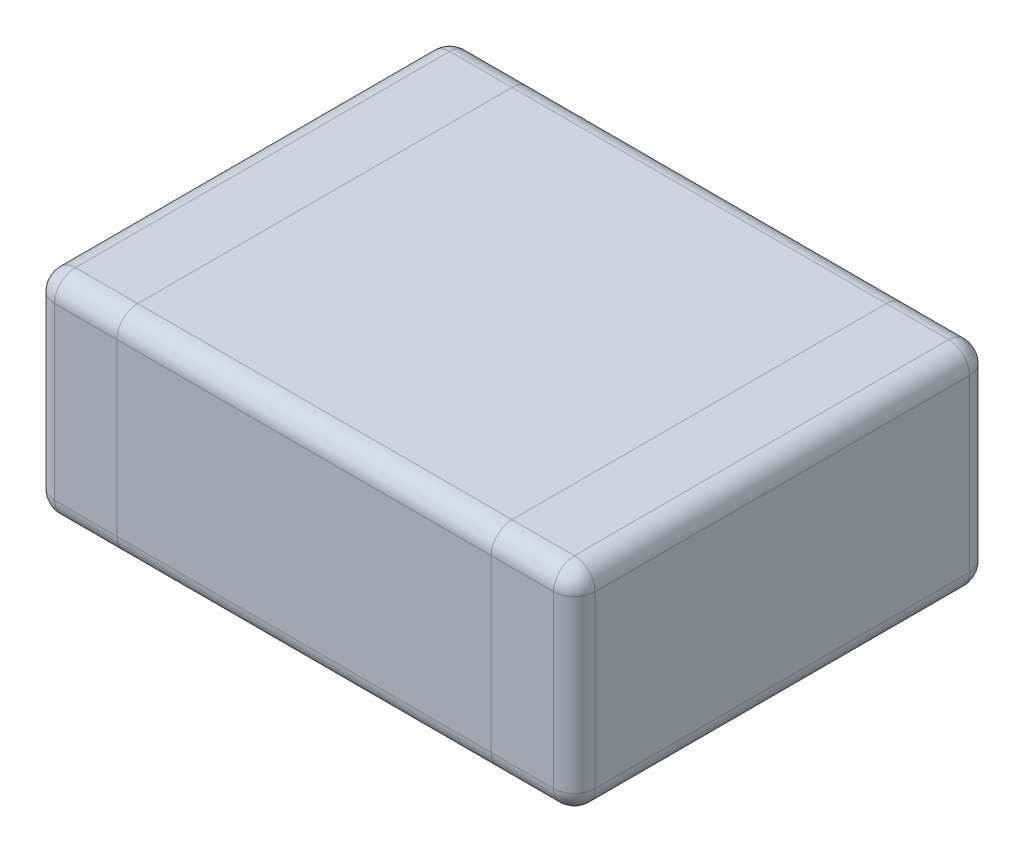
ISO-10303-21;
HEADER;
FILE_DESCRIPTION(('STEP AP214'),'2;1');
FILE_NAME('part.step','',(''),(''),'','','');
FILE_SCHEMA(('AUTOMOTIVE_DESIGN { 1 0 10303 214 1 1 1 1 }'));
ENDSEC;
DATA;
#1=APPLICATION_CONTEXT('core data for automotive mechanical design processes');
#2=APPLICATION_PROTOCOL_DEFINITION('international standard','automotive_design',2000,#1);
#3=PRODUCT_CONTEXT('',#1,'mechanical');
#4=PRODUCT('Part','Part','',(#3));
#5=PRODUCT_RELATED_PRODUCT_CATEGORY('part','',(#4));
#6=PRODUCT_DEFINITION_FORMATION('','',#4);
#7=PRODUCT_DEFINITION_CONTEXT('part definition',#1,'design');
#8=PRODUCT_DEFINITION('design','',#6,#7);
#9=PRODUCT_DEFINITION_SHAPE('','',#8);
#10=(LENGTH_UNIT() NAMED_UNIT(*) SI_UNIT(.MILLI.,.METRE.));
#11=(NAMED_UNIT(*) PLANE_ANGLE_UNIT() SI_UNIT($,.RADIAN.));
#12=(NAMED_UNIT(*) SI_UNIT($,.STERADIAN.) SOLID_ANGLE_UNIT());
#13=UNCERTAINTY_MEASURE_WITH_UNIT(LENGTH_MEASURE(1.E-05),#10,'distance_accuracy_value','');
#14=(GEOMETRIC_REPRESENTATION_CONTEXT(3) GLOBAL_UNCERTAINTY_ASSIGNED_CONTEXT((#13)) GLOBAL_UNIT_ASSIGNED_CONTEXT((#10,
#11,#12)) REPRESENTATION_CONTEXT('',''));
#15=CARTESIAN_POINT('',(0.,0.,0.));
#16=DIRECTION('',(0.,0.,1.));
#17=DIRECTION('',(1.,0.,0.));
#18=AXIS2_PLACEMENT_3D('',#15,#16,#17);
#19=CARTESIAN_POINT('',(0.65,0.51,-0.5));
#20=DIRECTION('',(0.,-1.,0.));
#21=DIRECTION('',(0.,0.,-1.));
#22=AXIS2_PLACEMENT_3D('',#19,#20,#21);
#23=PLANE('',#22);
#24=DIRECTION('',(0.,0.,1.));
#25=VECTOR('',#24,1.);
#26=CARTESIAN_POINT('',(-0.45,0.51,-0.5));
#27=LINE('',#26,#25);
#28=CARTESIAN_POINT('',(-0.45,0.51,-0.45));
#29=VERTEX_POINT('',#28);
#30=CARTESIAN_POINT('',(-0.45,0.51,0.45));
#31=VERTEX_POINT('',#30);
#32=EDGE_CURVE('E10',#29,#31,#27,.T.);
#33=ORIENTED_EDGE('',*,*,#32,.F.);
#34=DIRECTION('',(-1.,0.,0.));
#35=VECTOR('',#34,1.);
#36=CARTESIAN_POINT('',(0.65,0.51,-0.45));
#37=LINE('',#36,#35);
#38=CARTESIAN_POINT('',(-0.6,0.51,-0.45));
#39=VERTEX_POINT('',#38);
#40=EDGE_CURVE('E230',#29,#39,#37,.T.);
#41=ORIENTED_EDGE('',*,*,#40,.T.);
#42=DIRECTION('',(0.,0.,1.));
#43=VECTOR('',#42,1.);
#44=CARTESIAN_POINT('',(-0.6,0.51,-0.5));
#45=LINE('',#44,#43);
#46=CARTESIAN_POINT('',(-0.6,0.51,0.45));
#47=VERTEX_POINT('',#46);
#48=EDGE_CURVE('E233',#39,#47,#45,.T.);
#49=ORIENTED_EDGE('',*,*,#48,.T.);
#50=DIRECTION('',(1.,0.,0.));
#51=VECTOR('',#50,1.);
#52=CARTESIAN_POINT('',(0.65,0.51,0.45));
#53=LINE('',#52,#51);
#54=EDGE_CURVE('E237',#47,#31,#53,.T.);
#55=ORIENTED_EDGE('',*,*,#54,.T.);
#56=EDGE_LOOP('',(#33,#41,#49,#55));
#57=FACE_BOUND('',#56,.T.);
#58=ADVANCED_FACE('F15',(#57),#23,.F.);
#59=DIRECTION('',(0.,0.,-1.));
#60=VECTOR('',#59,1.);
#61=CARTESIAN_POINT('',(0.45,0.51,-0.5));
#62=LINE('',#61,#60);
#63=CARTESIAN_POINT('',(0.45,0.51,0.45));
#64=VERTEX_POINT('',#63);
#65=CARTESIAN_POINT('',(0.45,0.51,-0.45));
#66=VERTEX_POINT('',#65);
#67=EDGE_CURVE('E24',#64,#66,#62,.T.);
#68=ORIENTED_EDGE('',*,*,#67,.F.);
#69=CARTESIAN_POINT('',(0.6,0.51,0.45));
#70=VERTEX_POINT('',#69);
#71=EDGE_CURVE('E236',#64,#70,#53,.T.);
#72=ORIENTED_EDGE('',*,*,#71,.T.);
#73=DIRECTION('',(0.,0.,-1.));
#74=VECTOR('',#73,1.);
#75=CARTESIAN_POINT('',(0.6,0.51,-0.5));
#76=LINE('',#75,#74);
#77=CARTESIAN_POINT('',(0.6,0.51,-0.45));
#78=VERTEX_POINT('',#77);
#79=EDGE_CURVE('E227',#70,#78,#76,.T.);
#80=ORIENTED_EDGE('',*,*,#79,.T.);
#81=EDGE_CURVE('E231',#78,#66,#37,.T.);
#82=ORIENTED_EDGE('',*,*,#81,.T.);
#83=EDGE_LOOP('',(#68,#72,#80,#82));
#84=FACE_BOUND('',#83,.T.);
#85=ADVANCED_FACE('F488',(#84),#23,.F.);
#86=CARTESIAN_POINT('',(0.65,0.46,0.45));
#87=DIRECTION('',(1.,0.,0.));
#88=DIRECTION('',(0.,0.,-1.));
#89=AXIS2_PLACEMENT_3D('',#86,#87,#88);
#90=CYLINDRICAL_SURFACE('',#89,0.05);
#91=DIRECTION('',(1.,0.,0.));
#92=VECTOR('',#91,1.);
#93=CARTESIAN_POINT('',(-0.65,0.46,0.5));
#94=LINE('',#93,#92);
#95=CARTESIAN_POINT('',(-0.45,0.46,0.5));
#96=VERTEX_POINT('',#95);
#97=CARTESIAN_POINT('',(-0.6,0.46,0.5));
#98=VERTEX_POINT('',#97);
#99=EDGE_CURVE('E223',#96,#98,#94,.F.);
#100=ORIENTED_EDGE('',*,*,#99,.F.);
#101=CARTESIAN_POINT('',(-0.45,0.46,0.45));
#102=DIRECTION('',(1.,0.,0.));
#103=DIRECTION('',(0.,0.,-1.));
#104=AXIS2_PLACEMENT_3D('',#101,#102,#103);
#105=CIRCLE('',#104,0.05);
#106=EDGE_CURVE('E327',#96,#31,#105,.F.);
#107=ORIENTED_EDGE('',*,*,#106,.T.);
#108=ORIENTED_EDGE('',*,*,#54,.F.);
#109=CARTESIAN_POINT('',(-0.6,0.46,0.45));
#110=DIRECTION('',(-1.,0.,0.));
#111=DIRECTION('',(0.,-1.,0.));
#112=AXIS2_PLACEMENT_3D('',#109,#110,#111);
#113=CIRCLE('',#112,0.05);
#114=EDGE_CURVE('E307',#47,#98,#113,.F.);
#115=ORIENTED_EDGE('',*,*,#114,.T.);
#116=EDGE_LOOP('',(#100,#107,#108,#115));
#117=FACE_BOUND('',#116,.T.);
#118=ADVANCED_FACE('F443',(#117),#90,.T.);
#119=ORIENTED_EDGE('',*,*,#71,.F.);
#120=CARTESIAN_POINT('',(0.45,0.46,0.45));
#121=DIRECTION('',(-1.,0.,0.));
#122=DIRECTION('',(0.,0.,1.));
#123=AXIS2_PLACEMENT_3D('',#120,#121,#122);
#124=CIRCLE('',#123,0.05);
#125=CARTESIAN_POINT('',(0.45,0.46,0.5));
#126=VERTEX_POINT('',#125);
#127=EDGE_CURVE('E326',#64,#126,#124,.F.);
#128=ORIENTED_EDGE('',*,*,#127,.T.);
#129=CARTESIAN_POINT('',(0.6,0.46,0.5));
#130=VERTEX_POINT('',#129);
#131=EDGE_CURVE('E224',#130,#126,#94,.F.);
#132=ORIENTED_EDGE('',*,*,#131,.F.);
#133=CARTESIAN_POINT('',(0.6,0.46,0.45));
#134=DIRECTION('',(1.,0.,0.));
#135=DIRECTION('',(0.,0.,-1.));
#136=AXIS2_PLACEMENT_3D('',#133,#134,#135);
#137=CIRCLE('',#136,0.05);
#138=EDGE_CURVE('E292',#70,#130,#137,.T.);
#139=ORIENTED_EDGE('',*,*,#138,.F.);
#140=EDGE_LOOP('',(#119,#128,#132,#139));
#141=FACE_BOUND('',#140,.T.);
#142=ADVANCED_FACE('F417',(#141),#90,.T.);
#143=CARTESIAN_POINT('',(-0.65,0.51,0.5));
#144=DIRECTION('',(0.,0.,-1.));
#145=DIRECTION('',(-1.,0.,0.));
#146=AXIS2_PLACEMENT_3D('',#143,#144,#145);
#147=PLANE('',#146);
#148=DIRECTION('',(0.,-1.,0.));
#149=VECTOR('',#148,1.);
#150=CARTESIAN_POINT('',(-0.45,0.51,0.5));
#151=LINE('',#150,#149);
#152=CARTESIAN_POINT('',(-0.45,0.05,0.5));
#153=VERTEX_POINT('',#152);
#154=EDGE_CURVE('E323',#96,#153,#151,.T.);
#155=ORIENTED_EDGE('',*,*,#154,.F.);
#156=ORIENTED_EDGE('',*,*,#99,.T.);
#157=DIRECTION('',(0.,-1.,0.));
#158=VECTOR('',#157,1.);
#159=CARTESIAN_POINT('',(-0.6,0.51,0.5));
#160=LINE('',#159,#158);
#161=CARTESIAN_POINT('',(-0.6,0.05,0.5));
#162=VERTEX_POINT('',#161);
#163=EDGE_CURVE('E220',#98,#162,#160,.T.);
#164=ORIENTED_EDGE('',*,*,#163,.T.);
#165=DIRECTION('',(1.,0.,0.));
#166=VECTOR('',#165,1.);
#167=CARTESIAN_POINT('',(0.65,0.05,0.5));
#168=LINE('',#167,#166);
#169=EDGE_CURVE('E214',#162,#153,#168,.T.);
#170=ORIENTED_EDGE('',*,*,#169,.T.);
#171=EDGE_LOOP('',(#155,#156,#164,#170));
#172=FACE_BOUND('',#171,.T.);
#173=ADVANCED_FACE('F431',(#172),#147,.F.);
#174=DIRECTION('',(0.,1.,0.));
#175=VECTOR('',#174,1.);
#176=CARTESIAN_POINT('',(0.45,0.51,0.5));
#177=LINE('',#176,#175);
#178=CARTESIAN_POINT('',(0.45,0.05,0.5));
#179=VERTEX_POINT('',#178);
#180=EDGE_CURVE('E320',#179,#126,#177,.T.);
#181=ORIENTED_EDGE('',*,*,#180,.F.);
#182=CARTESIAN_POINT('',(0.6,0.05,0.5));
#183=VERTEX_POINT('',#182);
#184=EDGE_CURVE('E213',#179,#183,#168,.T.);
#185=ORIENTED_EDGE('',*,*,#184,.T.);
#186=DIRECTION('',(0.,-1.,0.));
#187=VECTOR('',#186,1.);
#188=CARTESIAN_POINT('',(0.6,0.51,0.5));
#189=LINE('',#188,#187);
#190=EDGE_CURVE('E217',#183,#130,#189,.F.);
#191=ORIENTED_EDGE('',*,*,#190,.T.);
#192=ORIENTED_EDGE('',*,*,#131,.T.);
#193=EDGE_LOOP('',(#181,#185,#191,#192));
#194=FACE_BOUND('',#193,.T.);
#195=ADVANCED_FACE('F413',(#194),#147,.F.);
#196=CARTESIAN_POINT('',(-0.65,0.05,0.45));
#197=DIRECTION('',(-1.,0.,0.));
#198=DIRECTION('',(0.,0.,1.));
#199=AXIS2_PLACEMENT_3D('',#196,#197,#198);
#200=CYLINDRICAL_SURFACE('',#199,0.05);
#201=DIRECTION('',(1.,0.,0.));
#202=VECTOR('',#201,1.);
#203=CARTESIAN_POINT('',(-0.65,0.,0.45));
#204=LINE('',#203,#202);
#205=CARTESIAN_POINT('',(-0.45,0.,0.45));
#206=VERTEX_POINT('',#205);
#207=CARTESIAN_POINT('',(-0.6,0.,0.45));
#208=VERTEX_POINT('',#207);
#209=EDGE_CURVE('E243',#206,#208,#204,.F.);
#210=ORIENTED_EDGE('',*,*,#209,.F.);
#211=CARTESIAN_POINT('',(-0.45,0.05,0.45));
#212=DIRECTION('',(1.,0.,0.));
#213=DIRECTION('',(0.,0.,-1.));
#214=AXIS2_PLACEMENT_3D('',#211,#212,#213);
#215=CIRCLE('',#214,0.05);
#216=EDGE_CURVE('E324',#206,#153,#215,.F.);
#217=ORIENTED_EDGE('',*,*,#216,.T.);
#218=ORIENTED_EDGE('',*,*,#169,.F.);
#219=CARTESIAN_POINT('',(-0.6,0.05,0.45));
#220=DIRECTION('',(-1.,0.,0.));
#221=DIRECTION('',(0.,0.,1.));
#222=AXIS2_PLACEMENT_3D('',#219,#220,#221);
#223=CIRCLE('',#222,0.05);
#224=EDGE_CURVE('E298',#162,#208,#223,.F.);
#225=ORIENTED_EDGE('',*,*,#224,.T.);
#226=EDGE_LOOP('',(#210,#217,#218,#225));
#227=FACE_BOUND('',#226,.T.);
#228=ADVANCED_FACE('F469',(#227),#200,.T.);
#229=ORIENTED_EDGE('',*,*,#184,.F.);
#230=CARTESIAN_POINT('',(0.45,0.05,0.45));
#231=DIRECTION('',(-1.,0.,0.));
#232=DIRECTION('',(0.,0.,1.));
#233=AXIS2_PLACEMENT_3D('',#230,#231,#232);
#234=CIRCLE('',#233,0.05);
#235=CARTESIAN_POINT('',(0.45,0.,0.45));
#236=VERTEX_POINT('',#235);
#237=EDGE_CURVE('E335',#179,#236,#234,.F.);
#238=ORIENTED_EDGE('',*,*,#237,.T.);
#239=CARTESIAN_POINT('',(0.6,0.,0.45));
#240=VERTEX_POINT('',#239);
#241=EDGE_CURVE('E244',#240,#236,#204,.F.);
#242=ORIENTED_EDGE('',*,*,#241,.F.);
#243=CARTESIAN_POINT('',(0.6,0.05,0.45));
#244=DIRECTION('',(1.,0.,0.));
#245=DIRECTION('',(0.,0.,-1.));
#246=AXIS2_PLACEMENT_3D('',#243,#244,#245);
#247=CIRCLE('',#246,0.05);
#248=EDGE_CURVE('E278',#183,#240,#247,.T.);
#249=ORIENTED_EDGE('',*,*,#248,.F.);
#250=EDGE_LOOP('',(#229,#238,#242,#249));
#251=FACE_BOUND('',#250,.T.);
#252=ADVANCED_FACE('F403',(#251),#200,.T.);
#253=CARTESIAN_POINT('',(0.65,0.,-0.5));
#254=DIRECTION('',(0.,-1.,0.));
#255=DIRECTION('',(0.,0.,-1.));
#256=AXIS2_PLACEMENT_3D('',#253,#254,#255);
#257=PLANE('',#256);
#258=DIRECTION('',(-1.,0.,0.));
#259=VECTOR('',#258,1.);
#260=CARTESIAN_POINT('',(0.65,0.,-0.45));
#261=LINE('',#260,#259);
#262=CARTESIAN_POINT('',(-0.6,0.,-0.45));
#263=VERTEX_POINT('',#262);
#264=CARTESIAN_POINT('',(-0.45,0.,-0.45));
#265=VERTEX_POINT('',#264);
#266=EDGE_CURVE('E251',#263,#265,#261,.F.);
#267=ORIENTED_EDGE('',*,*,#266,.T.);
#268=DIRECTION('',(0.,0.,1.));
#269=VECTOR('',#268,1.);
#270=CARTESIAN_POINT('',(-0.45,0.,-0.5));
#271=LINE('',#270,#269);
#272=EDGE_CURVE('E336',#265,#206,#271,.T.);
#273=ORIENTED_EDGE('',*,*,#272,.T.);
#274=ORIENTED_EDGE('',*,*,#209,.T.);
#275=DIRECTION('',(0.,0.,1.));
#276=VECTOR('',#275,1.);
#277=CARTESIAN_POINT('',(-0.6,0.,-0.5));
#278=LINE('',#277,#276);
#279=EDGE_CURVE('E247',#208,#263,#278,.F.);
#280=ORIENTED_EDGE('',*,*,#279,.T.);
#281=EDGE_LOOP('',(#267,#273,#274,#280));
#282=FACE_BOUND('',#281,.T.);
#283=ADVANCED_FACE('F472',(#282),#257,.T.);
#284=ORIENTED_EDGE('',*,*,#241,.T.);
#285=DIRECTION('',(0.,0.,-1.));
#286=VECTOR('',#285,1.);
#287=CARTESIAN_POINT('',(0.45,0.,-0.5));
#288=LINE('',#287,#286);
#289=CARTESIAN_POINT('',(0.45,0.,-0.45));
#290=VERTEX_POINT('',#289);
#291=EDGE_CURVE('E331',#236,#290,#288,.T.);
#292=ORIENTED_EDGE('',*,*,#291,.T.);
#293=CARTESIAN_POINT('',(0.6,0.,-0.45));
#294=VERTEX_POINT('',#293);
#295=EDGE_CURVE('E250',#290,#294,#261,.F.);
#296=ORIENTED_EDGE('',*,*,#295,.T.);
#297=DIRECTION('',(0.,0.,-1.));
#298=VECTOR('',#297,1.);
#299=CARTESIAN_POINT('',(0.6,0.,0.5));
#300=LINE('',#299,#298);
#301=EDGE_CURVE('E240',#294,#240,#300,.F.);
#302=ORIENTED_EDGE('',*,*,#301,.T.);
#303=EDGE_LOOP('',(#284,#292,#296,#302));
#304=FACE_BOUND('',#303,.T.);
#305=ADVANCED_FACE('F348',(#304),#257,.T.);
#306=CARTESIAN_POINT('',(0.65,0.46,-0.45));
#307=DIRECTION('',(-1.,0.,0.));
#308=DIRECTION('',(0.,0.,1.));
#309=AXIS2_PLACEMENT_3D('',#306,#307,#308);
#310=CYLINDRICAL_SURFACE('',#309,0.05);
#311=ORIENTED_EDGE('',*,*,#40,.F.);
#312=CARTESIAN_POINT('',(-0.45,0.46,-0.45));
#313=DIRECTION('',(1.,0.,0.));
#314=DIRECTION('',(0.,0.,-1.));
#315=AXIS2_PLACEMENT_3D('',#312,#313,#314);
#316=CIRCLE('',#315,0.05);
#317=CARTESIAN_POINT('',(-0.45,0.46,-0.5));
#318=VERTEX_POINT('',#317);
#319=EDGE_CURVE('E329',#29,#318,#316,.F.);
#320=ORIENTED_EDGE('',*,*,#319,.T.);
#321=DIRECTION('',(-1.,0.,0.));
#322=VECTOR('',#321,1.);
#323=CARTESIAN_POINT('',(-0.65,0.46,-0.5));
#324=LINE('',#323,#322);
#325=CARTESIAN_POINT('',(-0.6,0.46,-0.5));
#326=VERTEX_POINT('',#325);
#327=EDGE_CURVE('E193',#326,#318,#324,.F.);
#328=ORIENTED_EDGE('',*,*,#327,.F.);
#329=CARTESIAN_POINT('',(-0.6,0.46,-0.45));
#330=DIRECTION('',(-1.,0.,0.));
#331=DIRECTION('',(0.,0.,1.));
#332=AXIS2_PLACEMENT_3D('',#329,#330,#331);
#333=CIRCLE('',#332,0.05);
#334=EDGE_CURVE('E269',#326,#39,#333,.F.);
#335=ORIENTED_EDGE('',*,*,#334,.T.);
#336=EDGE_LOOP('',(#311,#320,#328,#335));
#337=FACE_BOUND('',#336,.T.);
#338=ADVANCED_FACE('F481',(#337),#310,.T.);
#339=CARTESIAN_POINT('',(0.45,0.46,-0.5));
#340=VERTEX_POINT('',#339);
#341=CARTESIAN_POINT('',(0.6,0.46,-0.5));
#342=VERTEX_POINT('',#341);
#343=EDGE_CURVE('E188',#340,#342,#324,.F.);
#344=ORIENTED_EDGE('',*,*,#343,.F.);
#345=CARTESIAN_POINT('',(0.45,0.46,-0.45));
#346=DIRECTION('',(-1.,0.,0.));
#347=DIRECTION('',(0.,0.,1.));
#348=AXIS2_PLACEMENT_3D('',#345,#346,#347);
#349=CIRCLE('',#348,0.05);
#350=EDGE_CURVE('E332',#340,#66,#349,.F.);
#351=ORIENTED_EDGE('',*,*,#350,.T.);
#352=ORIENTED_EDGE('',*,*,#81,.F.);
#353=CARTESIAN_POINT('',(0.6,0.46,-0.45));
#354=DIRECTION('',(1.,0.,0.));
#355=DIRECTION('',(0.,1.,0.));
#356=AXIS2_PLACEMENT_3D('',#353,#354,#355);
#357=CIRCLE('',#356,0.05);
#358=EDGE_CURVE('E173',#342,#78,#357,.T.);
#359=ORIENTED_EDGE('',*,*,#358,.F.);
#360=EDGE_LOOP('',(#344,#351,#352,#359));
#361=FACE_BOUND('',#360,.T.);
#362=ADVANCED_FACE('F382',(#361),#310,.T.);
#363=CARTESIAN_POINT('',(-0.65,0.05,-0.45));
#364=DIRECTION('',(1.,0.,0.));
#365=DIRECTION('',(0.,0.,-1.));
#366=AXIS2_PLACEMENT_3D('',#363,#364,#365);
#367=CYLINDRICAL_SURFACE('',#366,0.05);
#368=DIRECTION('',(-1.,0.,0.));
#369=VECTOR('',#368,1.);
#370=CARTESIAN_POINT('',(-0.65,0.05,-0.5));
#371=LINE('',#370,#369);
#372=CARTESIAN_POINT('',(-0.45,0.05,-0.5));
#373=VERTEX_POINT('',#372);
#374=CARTESIAN_POINT('',(-0.6,0.05,-0.5));
#375=VERTEX_POINT('',#374);
#376=EDGE_CURVE('E185',#373,#375,#371,.T.);
#377=ORIENTED_EDGE('',*,*,#376,.F.);
#378=CARTESIAN_POINT('',(-0.45,0.05,-0.45));
#379=DIRECTION('',(1.,0.,0.));
#380=DIRECTION('',(0.,0.,-1.));
#381=AXIS2_PLACEMENT_3D('',#378,#379,#380);
#382=CIRCLE('',#381,0.05);
#383=EDGE_CURVE('E339',#373,#265,#382,.F.);
#384=ORIENTED_EDGE('',*,*,#383,.T.);
#385=ORIENTED_EDGE('',*,*,#266,.F.);
#386=CARTESIAN_POINT('',(-0.6,0.05,-0.45));
#387=DIRECTION('',(-1.,0.,0.));
#388=DIRECTION('',(0.,0.,1.));
#389=AXIS2_PLACEMENT_3D('',#386,#387,#388);
#390=CIRCLE('',#389,0.05);
#391=EDGE_CURVE('E266',#263,#375,#390,.F.);
#392=ORIENTED_EDGE('',*,*,#391,.T.);
#393=EDGE_LOOP('',(#377,#384,#385,#392));
#394=FACE_BOUND('',#393,.T.);
#395=ADVANCED_FACE('F365',(#394),#367,.T.);
#396=ORIENTED_EDGE('',*,*,#295,.F.);
#397=CARTESIAN_POINT('',(0.45,0.05,-0.45));
#398=DIRECTION('',(-1.,0.,0.));
#399=DIRECTION('',(0.,0.,1.));
#400=AXIS2_PLACEMENT_3D('',#397,#398,#399);
#401=CIRCLE('',#400,0.05);
#402=CARTESIAN_POINT('',(0.45,0.05,-0.5));
#403=VERTEX_POINT('',#402);
#404=EDGE_CURVE('E19',#290,#403,#401,.F.);
#405=ORIENTED_EDGE('',*,*,#404,.T.);
#406=CARTESIAN_POINT('',(0.6,0.05,-0.5));
#407=VERTEX_POINT('',#406);
#408=EDGE_CURVE('E176',#407,#403,#371,.T.);
#409=ORIENTED_EDGE('',*,*,#408,.F.);
#410=CARTESIAN_POINT('',(0.6,0.05,-0.45));
#411=DIRECTION('',(1.,0.,0.));
#412=DIRECTION('',(0.,0.,-1.));
#413=AXIS2_PLACEMENT_3D('',#410,#411,#412);
#414=CIRCLE('',#413,0.05);
#415=EDGE_CURVE('E165',#294,#407,#414,.T.);
#416=ORIENTED_EDGE('',*,*,#415,.F.);
#417=EDGE_LOOP('',(#396,#405,#409,#416));
#418=FACE_BOUND('',#417,.T.);
#419=ADVANCED_FACE('F177',(#418),#367,.T.);
#420=CARTESIAN_POINT('',(-0.65,0.51,-0.5));
#421=DIRECTION('',(0.,0.,1.));
#422=DIRECTION('',(1.,0.,0.));
#423=AXIS2_PLACEMENT_3D('',#420,#421,#422);
#424=PLANE('',#423);
#425=DIRECTION('',(0.,1.,0.));
#426=VECTOR('',#425,1.);
#427=CARTESIAN_POINT('',(-0.45,0.51,-0.5));
#428=LINE('',#427,#426);
#429=EDGE_CURVE('E317',#373,#318,#428,.T.);
#430=ORIENTED_EDGE('',*,*,#429,.F.);
#431=ORIENTED_EDGE('',*,*,#376,.T.);
#432=DIRECTION('',(0.,-1.,0.));
#433=VECTOR('',#432,1.);
#434=CARTESIAN_POINT('',(-0.6,0.51,-0.5));
#435=LINE('',#434,#433);
#436=EDGE_CURVE('E182',#375,#326,#435,.F.);
#437=ORIENTED_EDGE('',*,*,#436,.T.);
#438=ORIENTED_EDGE('',*,*,#327,.T.);
#439=EDGE_LOOP('',(#430,#431,#437,#438));
#440=FACE_BOUND('',#439,.T.);
#441=ADVANCED_FACE('F368',(#440),#424,.F.);
#442=DIRECTION('',(0.,-1.,0.));
#443=VECTOR('',#442,1.);
#444=CARTESIAN_POINT('',(0.45,0.51,-0.5));
#445=LINE('',#444,#443);
#446=EDGE_CURVE('E253',#340,#403,#445,.T.);
#447=ORIENTED_EDGE('',*,*,#446,.F.);
#448=ORIENTED_EDGE('',*,*,#343,.T.);
#449=DIRECTION('',(0.,-1.,0.));
#450=VECTOR('',#449,1.);
#451=CARTESIAN_POINT('',(0.6,0.51,-0.5));
#452=LINE('',#451,#450);
#453=EDGE_CURVE('E157',#342,#407,#452,.T.);
#454=ORIENTED_EDGE('',*,*,#453,.T.);
#455=ORIENTED_EDGE('',*,*,#408,.T.);
#456=EDGE_LOOP('',(#447,#448,#454,#455));
#457=FACE_BOUND('',#456,.T.);
#458=ADVANCED_FACE('F186',(#457),#424,.F.);
#459=CARTESIAN_POINT('',(0.65,0.51,0.5));
#460=DIRECTION('',(-1.,0.,0.));
#461=DIRECTION('',(0.,0.,1.));
#462=AXIS2_PLACEMENT_3D('',#459,#460,#461);
#463=PLANE('',#462);
#464=DIRECTION('',(0.,-1.,0.));
#465=VECTOR('',#464,1.);
#466=CARTESIAN_POINT('',(0.65,0.51,-0.45));
#467=LINE('',#466,#465);
#468=CARTESIAN_POINT('',(0.65,0.05,-0.45));
#469=VERTEX_POINT('',#468);
#470=CARTESIAN_POINT('',(0.65,0.46,-0.45));
#471=VERTEX_POINT('',#470);
#472=EDGE_CURVE('E159',#469,#471,#467,.F.);
#473=ORIENTED_EDGE('',*,*,#472,.T.);
#474=DIRECTION('',(0.,0.,-1.));
#475=VECTOR('',#474,1.);
#476=CARTESIAN_POINT('',(0.65,0.46,0.5));
#477=LINE('',#476,#475);
#478=CARTESIAN_POINT('',(0.65,0.46,0.45));
#479=VERTEX_POINT('',#478);
#480=EDGE_CURVE('E202',#471,#479,#477,.F.);
#481=ORIENTED_EDGE('',*,*,#480,.T.);
#482=DIRECTION('',(0.,-1.,0.));
#483=VECTOR('',#482,1.);
#484=CARTESIAN_POINT('',(0.65,0.51,0.45));
#485=LINE('',#484,#483);
#486=CARTESIAN_POINT('',(0.65,0.05,0.45));
#487=VERTEX_POINT('',#486);
#488=EDGE_CURVE('E199',#479,#487,#485,.T.);
#489=ORIENTED_EDGE('',*,*,#488,.T.);
#490=DIRECTION('',(0.,0.,-1.));
#491=VECTOR('',#490,1.);
#492=CARTESIAN_POINT('',(0.65,0.05,-0.5));
#493=LINE('',#492,#491);
#494=EDGE_CURVE('E197',#487,#469,#493,.T.);
#495=ORIENTED_EDGE('',*,*,#494,.T.);
#496=EDGE_LOOP('',(#473,#481,#489,#495));
#497=FACE_BOUND('',#496,.T.);
#498=ADVANCED_FACE('F394',(#497),#463,.F.);
#499=EDGE_CURVE('E183',#403,#373,#371,.T.);
#500=ORIENTED_EDGE('',*,*,#499,.T.);
#501=ORIENTED_EDGE('',*,*,#429,.T.);
#502=EDGE_CURVE('E191',#318,#340,#324,.F.);
#503=ORIENTED_EDGE('',*,*,#502,.T.);
#504=ORIENTED_EDGE('',*,*,#446,.T.);
#505=EDGE_LOOP('',(#500,#501,#503,#504));
#506=FACE_BOUND('',#505,.T.);
#507=ADVANCED_FACE('F374',(#506),#424,.F.);
#508=CARTESIAN_POINT('',(-0.65,0.51,0.5));
#509=DIRECTION('',(1.,0.,0.));
#510=DIRECTION('',(0.,0.,-1.));
#511=AXIS2_PLACEMENT_3D('',#508,#509,#510);
#512=PLANE('',#511);
#513=DIRECTION('',(0.,-1.,0.));
#514=VECTOR('',#513,1.);
#515=CARTESIAN_POINT('',(-0.65,0.51,0.45));
#516=LINE('',#515,#514);
#517=CARTESIAN_POINT('',(-0.65,0.05,0.45));
#518=VERTEX_POINT('',#517);
#519=CARTESIAN_POINT('',(-0.65,0.46,0.45));
#520=VERTEX_POINT('',#519);
#521=EDGE_CURVE('E206',#518,#520,#516,.F.);
#522=ORIENTED_EDGE('',*,*,#521,.T.);
#523=DIRECTION('',(0.,0.,1.));
#524=VECTOR('',#523,1.);
#525=CARTESIAN_POINT('',(-0.65,0.46,0.5));
#526=LINE('',#525,#524);
#527=CARTESIAN_POINT('',(-0.65,0.46,-0.45));
#528=VERTEX_POINT('',#527);
#529=EDGE_CURVE('E211',#520,#528,#526,.F.);
#530=ORIENTED_EDGE('',*,*,#529,.T.);
#531=DIRECTION('',(0.,-1.,0.));
#532=VECTOR('',#531,1.);
#533=CARTESIAN_POINT('',(-0.65,0.51,-0.45));
#534=LINE('',#533,#532);
#535=CARTESIAN_POINT('',(-0.65,0.05,-0.45));
#536=VERTEX_POINT('',#535);
#537=EDGE_CURVE('E208',#528,#536,#534,.T.);
#538=ORIENTED_EDGE('',*,*,#537,.T.);
#539=DIRECTION('',(0.,0.,1.));
#540=VECTOR('',#539,1.);
#541=CARTESIAN_POINT('',(-0.65,0.05,0.5));
#542=LINE('',#541,#540);
#543=EDGE_CURVE('E204',#536,#518,#542,.T.);
#544=ORIENTED_EDGE('',*,*,#543,.T.);
#545=EDGE_LOOP('',(#522,#530,#538,#544));
#546=FACE_BOUND('',#545,.T.);
#547=ADVANCED_FACE('F451',(#546),#512,.F.);
#548=EDGE_CURVE('E228',#126,#96,#94,.F.);
#549=ORIENTED_EDGE('',*,*,#548,.T.);
#550=ORIENTED_EDGE('',*,*,#154,.T.);
#551=EDGE_CURVE('E218',#153,#179,#168,.T.);
#552=ORIENTED_EDGE('',*,*,#551,.T.);
#553=ORIENTED_EDGE('',*,*,#180,.T.);
#554=EDGE_LOOP('',(#549,#550,#552,#553));
#555=FACE_BOUND('',#554,.T.);
#556=ADVANCED_FACE('F424',(#555),#147,.F.);
#557=EDGE_CURVE('E234',#66,#29,#37,.T.);
#558=ORIENTED_EDGE('',*,*,#557,.T.);
#559=ORIENTED_EDGE('',*,*,#32,.T.);
#560=EDGE_CURVE('E241',#31,#64,#53,.T.);
#561=ORIENTED_EDGE('',*,*,#560,.T.);
#562=ORIENTED_EDGE('',*,*,#67,.T.);
#563=EDGE_LOOP('',(#558,#559,#561,#562));
#564=FACE_BOUND('',#563,.T.);
#565=ADVANCED_FACE('F486',(#564),#23,.F.);
#566=ORIENTED_EDGE('',*,*,#272,.F.);
#567=EDGE_CURVE('E254',#265,#290,#261,.F.);
#568=ORIENTED_EDGE('',*,*,#567,.T.);
#569=ORIENTED_EDGE('',*,*,#291,.F.);
#570=EDGE_CURVE('E248',#236,#206,#204,.F.);
#571=ORIENTED_EDGE('',*,*,#570,.T.);
#572=EDGE_LOOP('',(#566,#568,#569,#571));
#573=FACE_BOUND('',#572,.T.);
#574=ADVANCED_FACE('F359',(#573),#257,.T.);
#575=CARTESIAN_POINT('',(-0.6,0.51,0.45));
#576=DIRECTION('',(0.,-1.,0.));
#577=DIRECTION('',(0.,0.,-1.));
#578=AXIS2_PLACEMENT_3D('',#575,#576,#577);
#579=CYLINDRICAL_SURFACE('',#578,0.05);
#580=CARTESIAN_POINT('',(-0.6,0.46,0.45));
#581=DIRECTION('',(0.,1.,0.));
#582=DIRECTION('',(0.,0.,1.));
#583=AXIS2_PLACEMENT_3D('',#580,#581,#582);
#584=CIRCLE('',#583,0.05);
#585=EDGE_CURVE('E313',#520,#98,#584,.T.);
#586=ORIENTED_EDGE('',*,*,#585,.F.);
#587=ORIENTED_EDGE('',*,*,#521,.F.);
#588=CARTESIAN_POINT('',(-0.6,0.05,0.45));
#589=DIRECTION('',(0.,-1.,0.));
#590=DIRECTION('',(0.,0.,-1.));
#591=AXIS2_PLACEMENT_3D('',#588,#589,#590);
#592=CIRCLE('',#591,0.05);
#593=EDGE_CURVE('E310',#162,#518,#592,.T.);
#594=ORIENTED_EDGE('',*,*,#593,.F.);
#595=ORIENTED_EDGE('',*,*,#163,.F.);
#596=EDGE_LOOP('',(#586,#587,#594,#595));
#597=FACE_BOUND('',#596,.T.);
#598=ADVANCED_FACE('F17',(#597),#579,.T.);
#599=CARTESIAN_POINT('',(-0.6,0.46,0.45));
#600=DIRECTION('',(0.,0.,1.));
#601=DIRECTION('',(1.,0.,0.));
#602=AXIS2_PLACEMENT_3D('',#599,#600,#601);
#603=SPHERICAL_SURFACE('',#602,0.05);
#604=CARTESIAN_POINT('',(-0.6,0.46,0.45));
#605=DIRECTION('',(0.,0.,1.));
#606=DIRECTION('',(1.,0.,0.));
#607=AXIS2_PLACEMENT_3D('',#604,#605,#606);
#608=CIRCLE('',#607,0.05);
#609=EDGE_CURVE('E304',#520,#47,#608,.F.);
#610=ORIENTED_EDGE('',*,*,#609,.F.);
#611=ORIENTED_EDGE('',*,*,#585,.T.);
#612=ORIENTED_EDGE('',*,*,#114,.F.);
#613=EDGE_LOOP('',(#610,#611,#612));
#614=FACE_BOUND('',#613,.T.);
#615=ADVANCED_FACE('F440',(#614),#603,.T.);
#616=CARTESIAN_POINT('',(-0.6,0.05,0.45));
#617=DIRECTION('',(0.,0.,1.));
#618=DIRECTION('',(1.,0.,0.));
#619=AXIS2_PLACEMENT_3D('',#616,#617,#618);
#620=SPHERICAL_SURFACE('',#619,0.05);
#621=ORIENTED_EDGE('',*,*,#224,.F.);
#622=ORIENTED_EDGE('',*,*,#593,.T.);
#623=CARTESIAN_POINT('',(-0.6,0.05,0.45));
#624=DIRECTION('',(0.,0.,1.));
#625=DIRECTION('',(1.,0.,0.));
#626=AXIS2_PLACEMENT_3D('',#623,#624,#625);
#627=CIRCLE('',#626,0.05);
#628=EDGE_CURVE('E301',#208,#518,#627,.F.);
#629=ORIENTED_EDGE('',*,*,#628,.F.);
#630=EDGE_LOOP('',(#621,#622,#629));
#631=FACE_BOUND('',#630,.T.);
#632=ADVANCED_FACE('F467',(#631),#620,.T.);
#633=ORIENTED_EDGE('',*,*,#106,.F.);
#634=ORIENTED_EDGE('',*,*,#548,.F.);
#635=ORIENTED_EDGE('',*,*,#127,.F.);
#636=ORIENTED_EDGE('',*,*,#560,.F.);
#637=EDGE_LOOP('',(#633,#634,#635,#636));
#638=FACE_BOUND('',#637,.T.);
#639=ADVANCED_FACE('F426',(#638),#90,.T.);
#640=CARTESIAN_POINT('',(-0.6,0.46,-0.5));
#641=DIRECTION('',(0.,0.,1.));
#642=DIRECTION('',(1.,0.,0.));
#643=AXIS2_PLACEMENT_3D('',#640,#641,#642);
#644=CYLINDRICAL_SURFACE('',#643,0.05);
#645=ORIENTED_EDGE('',*,*,#609,.T.);
#646=ORIENTED_EDGE('',*,*,#48,.F.);
#647=CARTESIAN_POINT('',(-0.6,0.46,-0.45));
#648=DIRECTION('',(0.,0.,-1.));
#649=DIRECTION('',(-1.,0.,0.));
#650=AXIS2_PLACEMENT_3D('',#647,#648,#649);
#651=CIRCLE('',#650,0.05);
#652=EDGE_CURVE('E289',#528,#39,#651,.T.);
#653=ORIENTED_EDGE('',*,*,#652,.F.);
#654=ORIENTED_EDGE('',*,*,#529,.F.);
#655=EDGE_LOOP('',(#645,#646,#653,#654));
#656=FACE_BOUND('',#655,.T.);
#657=ADVANCED_FACE('F448',(#656),#644,.T.);
#658=CARTESIAN_POINT('',(-0.6,0.51,-0.45));
#659=DIRECTION('',(0.,-1.,0.));
#660=DIRECTION('',(0.,0.,-1.));
#661=AXIS2_PLACEMENT_3D('',#658,#659,#660);
#662=CYLINDRICAL_SURFACE('',#661,0.05);
#663=CARTESIAN_POINT('',(-0.6,0.05,-0.45));
#664=DIRECTION('',(0.,-1.,0.));
#665=DIRECTION('',(0.,0.,-1.));
#666=AXIS2_PLACEMENT_3D('',#663,#664,#665);
#667=CIRCLE('',#666,0.05);
#668=EDGE_CURVE('E283',#536,#375,#667,.T.);
#669=ORIENTED_EDGE('',*,*,#668,.F.);
#670=ORIENTED_EDGE('',*,*,#537,.F.);
#671=CARTESIAN_POINT('',(-0.6,0.46,-0.45));
#672=DIRECTION('',(0.,1.,0.));
#673=DIRECTION('',(0.,0.,1.));
#674=AXIS2_PLACEMENT_3D('',#671,#672,#673);
#675=CIRCLE('',#674,0.05);
#676=EDGE_CURVE('E286',#326,#528,#675,.T.);
#677=ORIENTED_EDGE('',*,*,#676,.F.);
#678=ORIENTED_EDGE('',*,*,#436,.F.);
#679=EDGE_LOOP('',(#669,#670,#677,#678));
#680=FACE_BOUND('',#679,.T.);
#681=ADVANCED_FACE('F455',(#680),#662,.T.);
#682=CARTESIAN_POINT('',(-0.6,0.05,0.5));
#683=DIRECTION('',(0.,0.,-1.));
#684=DIRECTION('',(-1.,0.,0.));
#685=AXIS2_PLACEMENT_3D('',#682,#683,#684);
#686=CYLINDRICAL_SURFACE('',#685,0.05);
#687=ORIENTED_EDGE('',*,*,#628,.T.);
#688=ORIENTED_EDGE('',*,*,#543,.F.);
#689=CARTESIAN_POINT('',(-0.6,0.05,-0.45));
#690=DIRECTION('',(0.,0.,-1.));
#691=DIRECTION('',(-1.,0.,0.));
#692=AXIS2_PLACEMENT_3D('',#689,#690,#691);
#693=CIRCLE('',#692,0.05);
#694=EDGE_CURVE('E281',#263,#536,#693,.T.);
#695=ORIENTED_EDGE('',*,*,#694,.F.);
#696=ORIENTED_EDGE('',*,*,#279,.F.);
#697=EDGE_LOOP('',(#687,#688,#695,#696));
#698=FACE_BOUND('',#697,.T.);
#699=ADVANCED_FACE('F462',(#698),#686,.T.);
#700=ORIENTED_EDGE('',*,*,#216,.F.);
#701=ORIENTED_EDGE('',*,*,#570,.F.);
#702=ORIENTED_EDGE('',*,*,#237,.F.);
#703=ORIENTED_EDGE('',*,*,#551,.F.);
#704=EDGE_LOOP('',(#700,#701,#702,#703));
#705=FACE_BOUND('',#704,.T.);
#706=ADVANCED_FACE('F471',(#705),#200,.T.);
#707=CARTESIAN_POINT('',(0.6,0.51,0.45));
#708=DIRECTION('',(0.,-1.,0.));
#709=DIRECTION('',(0.,0.,-1.));
#710=AXIS2_PLACEMENT_3D('',#707,#708,#709);
#711=CYLINDRICAL_SURFACE('',#710,0.05);
#712=CARTESIAN_POINT('',(0.6,0.46,0.45));
#713=DIRECTION('',(0.,1.,0.));
#714=DIRECTION('',(0.,0.,1.));
#715=AXIS2_PLACEMENT_3D('',#712,#713,#714);
#716=CIRCLE('',#715,0.05);
#717=EDGE_CURVE('E295',#130,#479,#716,.T.);
#718=ORIENTED_EDGE('',*,*,#717,.F.);
#719=ORIENTED_EDGE('',*,*,#190,.F.);
#720=CARTESIAN_POINT('',(0.6,0.05,0.45));
#721=DIRECTION('',(0.,-1.,0.));
#722=DIRECTION('',(0.,0.,-1.));
#723=AXIS2_PLACEMENT_3D('',#720,#721,#722);
#724=CIRCLE('',#723,0.05);
#725=EDGE_CURVE('E275',#487,#183,#724,.T.);
#726=ORIENTED_EDGE('',*,*,#725,.F.);
#727=ORIENTED_EDGE('',*,*,#488,.F.);
#728=EDGE_LOOP('',(#718,#719,#726,#727));
#729=FACE_BOUND('',#728,.T.);
#730=ADVANCED_FACE('F410',(#729),#711,.T.);
#731=CARTESIAN_POINT('',(0.6,0.46,0.45));
#732=DIRECTION('',(0.,0.,1.));
#733=DIRECTION('',(1.,0.,0.));
#734=AXIS2_PLACEMENT_3D('',#731,#732,#733);
#735=SPHERICAL_SURFACE('',#734,0.05);
#736=ORIENTED_EDGE('',*,*,#138,.T.);
#737=ORIENTED_EDGE('',*,*,#717,.T.);
#738=CARTESIAN_POINT('',(0.6,0.46,0.45));
#739=DIRECTION('',(0.,0.,1.));
#740=DIRECTION('',(1.,0.,0.));
#741=AXIS2_PLACEMENT_3D('',#738,#739,#740);
#742=CIRCLE('',#741,0.05);
#743=EDGE_CURVE('E272',#70,#479,#742,.F.);
#744=ORIENTED_EDGE('',*,*,#743,.F.);
#745=EDGE_LOOP('',(#736,#737,#744));
#746=FACE_BOUND('',#745,.T.);
#747=ADVANCED_FACE('F499',(#746),#735,.T.);
#748=CARTESIAN_POINT('',(-0.6,0.46,-0.45));
#749=DIRECTION('',(0.,0.,1.));
#750=DIRECTION('',(1.,0.,0.));
#751=AXIS2_PLACEMENT_3D('',#748,#749,#750);
#752=SPHERICAL_SURFACE('',#751,0.05);
#753=ORIENTED_EDGE('',*,*,#676,.T.);
#754=ORIENTED_EDGE('',*,*,#652,.T.);
#755=ORIENTED_EDGE('',*,*,#334,.F.);
#756=EDGE_LOOP('',(#753,#754,#755));
#757=FACE_BOUND('',#756,.T.);
#758=ADVANCED_FACE('F501',(#757),#752,.T.);
#759=CARTESIAN_POINT('',(-0.6,0.05,-0.45));
#760=DIRECTION('',(0.,0.,1.));
#761=DIRECTION('',(1.,0.,0.));
#762=AXIS2_PLACEMENT_3D('',#759,#760,#761);
#763=SPHERICAL_SURFACE('',#762,0.05);
#764=ORIENTED_EDGE('',*,*,#694,.T.);
#765=ORIENTED_EDGE('',*,*,#668,.T.);
#766=ORIENTED_EDGE('',*,*,#391,.F.);
#767=EDGE_LOOP('',(#764,#765,#766));
#768=FACE_BOUND('',#767,.T.);
#769=ADVANCED_FACE('F508',(#768),#763,.T.);
#770=CARTESIAN_POINT('',(0.6,0.05,0.45));
#771=DIRECTION('',(0.,0.,1.));
#772=DIRECTION('',(1.,0.,0.));
#773=AXIS2_PLACEMENT_3D('',#770,#771,#772);
#774=SPHERICAL_SURFACE('',#773,0.05);
#775=ORIENTED_EDGE('',*,*,#725,.T.);
#776=ORIENTED_EDGE('',*,*,#248,.T.);
#777=CARTESIAN_POINT('',(0.6,0.05,0.45));
#778=DIRECTION('',(0.,0.,1.));
#779=DIRECTION('',(1.,0.,0.));
#780=AXIS2_PLACEMENT_3D('',#777,#778,#779);
#781=CIRCLE('',#780,0.05);
#782=EDGE_CURVE('E263',#487,#240,#781,.F.);
#783=ORIENTED_EDGE('',*,*,#782,.F.);
#784=EDGE_LOOP('',(#775,#776,#783));
#785=FACE_BOUND('',#784,.T.);
#786=ADVANCED_FACE('F406',(#785),#774,.T.);
#787=CARTESIAN_POINT('',(0.6,0.46,-0.5));
#788=DIRECTION('',(0.,0.,-1.));
#789=DIRECTION('',(-1.,0.,0.));
#790=AXIS2_PLACEMENT_3D('',#787,#788,#789);
#791=CYLINDRICAL_SURFACE('',#790,0.05);
#792=ORIENTED_EDGE('',*,*,#743,.T.);
#793=ORIENTED_EDGE('',*,*,#480,.F.);
#794=CARTESIAN_POINT('',(0.6,0.46,-0.45));
#795=DIRECTION('',(0.,0.,-1.));
#796=DIRECTION('',(-1.,0.,0.));
#797=AXIS2_PLACEMENT_3D('',#794,#795,#796);
#798=CIRCLE('',#797,0.05);
#799=EDGE_CURVE('E260',#78,#471,#798,.T.);
#800=ORIENTED_EDGE('',*,*,#799,.F.);
#801=ORIENTED_EDGE('',*,*,#79,.F.);
#802=EDGE_LOOP('',(#792,#793,#800,#801));
#803=FACE_BOUND('',#802,.T.);
#804=ADVANCED_FACE('F390',(#803),#791,.T.);
#805=ORIENTED_EDGE('',*,*,#319,.F.);
#806=ORIENTED_EDGE('',*,*,#557,.F.);
#807=ORIENTED_EDGE('',*,*,#350,.F.);
#808=ORIENTED_EDGE('',*,*,#502,.F.);
#809=EDGE_LOOP('',(#805,#806,#807,#808));
#810=FACE_BOUND('',#809,.T.);
#811=ADVANCED_FACE('F377',(#810),#310,.T.);
#812=ORIENTED_EDGE('',*,*,#383,.F.);
#813=ORIENTED_EDGE('',*,*,#499,.F.);
#814=ORIENTED_EDGE('',*,*,#404,.F.);
#815=ORIENTED_EDGE('',*,*,#567,.F.);
#816=EDGE_LOOP('',(#812,#813,#814,#815));
#817=FACE_BOUND('',#816,.T.);
#818=ADVANCED_FACE('F357',(#817),#367,.T.);
#819=CARTESIAN_POINT('',(0.6,0.05,0.5));
#820=DIRECTION('',(0.,0.,1.));
#821=DIRECTION('',(1.,0.,0.));
#822=AXIS2_PLACEMENT_3D('',#819,#820,#821);
#823=CYLINDRICAL_SURFACE('',#822,0.05);
#824=ORIENTED_EDGE('',*,*,#782,.T.);
#825=ORIENTED_EDGE('',*,*,#301,.F.);
#826=CARTESIAN_POINT('',(0.6,0.05,-0.45));
#827=DIRECTION('',(0.,0.,-1.));
#828=DIRECTION('',(-1.,0.,0.));
#829=AXIS2_PLACEMENT_3D('',#826,#827,#828);
#830=CIRCLE('',#829,0.05);
#831=EDGE_CURVE('E169',#469,#294,#830,.T.);
#832=ORIENTED_EDGE('',*,*,#831,.F.);
#833=ORIENTED_EDGE('',*,*,#494,.F.);
#834=EDGE_LOOP('',(#824,#825,#832,#833));
#835=FACE_BOUND('',#834,.T.);
#836=ADVANCED_FACE('F398',(#835),#823,.T.);
#837=CARTESIAN_POINT('',(0.6,0.46,-0.45));
#838=DIRECTION('',(0.,0.,1.));
#839=DIRECTION('',(1.,0.,0.));
#840=AXIS2_PLACEMENT_3D('',#837,#838,#839);
#841=SPHERICAL_SURFACE('',#840,0.05);
#842=ORIENTED_EDGE('',*,*,#358,.T.);
#843=ORIENTED_EDGE('',*,*,#799,.T.);
#844=CARTESIAN_POINT('',(0.6,0.46,-0.45));
#845=DIRECTION('',(0.,1.,0.));
#846=DIRECTION('',(0.,0.,1.));
#847=AXIS2_PLACEMENT_3D('',#844,#845,#846);
#848=CIRCLE('',#847,0.05);
#849=EDGE_CURVE('E162',#342,#471,#848,.F.);
#850=ORIENTED_EDGE('',*,*,#849,.F.);
#851=EDGE_LOOP('',(#842,#843,#850));
#852=FACE_BOUND('',#851,.T.);
#853=ADVANCED_FACE('F386',(#852),#841,.T.);
#854=CARTESIAN_POINT('',(0.6,0.05,-0.45));
#855=DIRECTION('',(0.,0.,1.));
#856=DIRECTION('',(1.,0.,0.));
#857=AXIS2_PLACEMENT_3D('',#854,#855,#856);
#858=SPHERICAL_SURFACE('',#857,0.05);
#859=ORIENTED_EDGE('',*,*,#831,.T.);
#860=ORIENTED_EDGE('',*,*,#415,.T.);
#861=CARTESIAN_POINT('',(0.6,0.05,-0.45));
#862=DIRECTION('',(0.,-1.,0.));
#863=DIRECTION('',(0.,0.,-1.));
#864=AXIS2_PLACEMENT_3D('',#861,#862,#863);
#865=CIRCLE('',#864,0.05);
#866=EDGE_CURVE('E153',#469,#407,#865,.F.);
#867=ORIENTED_EDGE('',*,*,#866,.F.);
#868=EDGE_LOOP('',(#859,#860,#867));
#869=FACE_BOUND('',#868,.T.);
#870=ADVANCED_FACE('F167',(#869),#858,.T.);
#871=CARTESIAN_POINT('',(0.6,0.51,-0.45));
#872=DIRECTION('',(0.,-1.,0.));
#873=DIRECTION('',(0.,0.,-1.));
#874=AXIS2_PLACEMENT_3D('',#871,#872,#873);
#875=CYLINDRICAL_SURFACE('',#874,0.05);
#876=ORIENTED_EDGE('',*,*,#849,.T.);
#877=ORIENTED_EDGE('',*,*,#472,.F.);
#878=ORIENTED_EDGE('',*,*,#866,.T.);
#879=ORIENTED_EDGE('',*,*,#453,.F.);
#880=EDGE_LOOP('',(#876,#877,#878,#879));
#881=FACE_BOUND('',#880,.T.);
#882=ADVANCED_FACE('F155',(#881),#875,.T.);
#883=CLOSED_SHELL('',(#58,#85,#118,#142,#173,#195,#228,#252,#283,#305,#338,#362,#395,#419,#441,
#458,#498,#507,#547,#556,#565,#574,#598,#615,#632,#639,#657,#681,#699,#706,#730,#747,#758,#769,
#786,#804,#811,#818,#836,#853,#870,#882));
#884=MANIFOLD_SOLID_BREP('B1',#883);
#885=ADVANCED_BREP_SHAPE_REPRESENTATION('',(#18,#884),#14);
#886=SHAPE_DEFINITION_REPRESENTATION(#9,#885);
ENDSEC;
END-ISO-10303-21;
